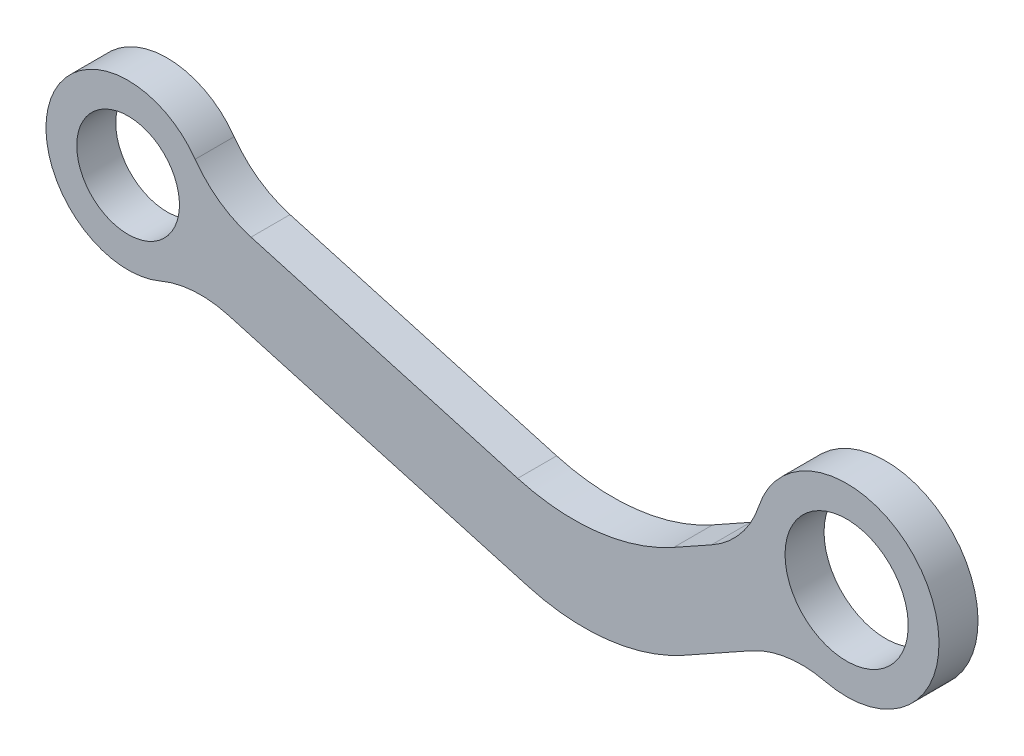
ISO-10303-21;
HEADER;
FILE_DESCRIPTION(('STEP AP214'),'2;1');
FILE_NAME('part.step','',(''),(''),'','','');
FILE_SCHEMA(('AUTOMOTIVE_DESIGN { 1 0 10303 214 1 1 1 1 }'));
ENDSEC;
DATA;
#1=APPLICATION_CONTEXT('core data for automotive mechanical design processes');
#2=APPLICATION_PROTOCOL_DEFINITION('international standard','automotive_design',2000,#1);
#3=PRODUCT_CONTEXT('',#1,'mechanical');
#4=PRODUCT('Part','Part','',(#3));
#5=PRODUCT_RELATED_PRODUCT_CATEGORY('part','',(#4));
#6=PRODUCT_DEFINITION_FORMATION('','',#4);
#7=PRODUCT_DEFINITION_CONTEXT('part definition',#1,'design');
#8=PRODUCT_DEFINITION('design','',#6,#7);
#9=PRODUCT_DEFINITION_SHAPE('','',#8);
#10=(LENGTH_UNIT() NAMED_UNIT(*) SI_UNIT(.MILLI.,.METRE.));
#11=(NAMED_UNIT(*) PLANE_ANGLE_UNIT() SI_UNIT($,.RADIAN.));
#12=(NAMED_UNIT(*) SI_UNIT($,.STERADIAN.) SOLID_ANGLE_UNIT());
#13=UNCERTAINTY_MEASURE_WITH_UNIT(LENGTH_MEASURE(1.E-05),#10,'distance_accuracy_value','');
#14=(GEOMETRIC_REPRESENTATION_CONTEXT(3) GLOBAL_UNCERTAINTY_ASSIGNED_CONTEXT((#13)) GLOBAL_UNIT_ASSIGNED_CONTEXT((#10,
#11,#12)) REPRESENTATION_CONTEXT('',''));
#15=CARTESIAN_POINT('',(0.,0.,0.));
#16=DIRECTION('',(0.,0.,1.));
#17=DIRECTION('',(1.,0.,0.));
#18=AXIS2_PLACEMENT_3D('',#15,#16,#17);
#19=CARTESIAN_POINT('',(35.,0.,1.9));
#20=DIRECTION('',(0.,0.,1.));
#21=DIRECTION('',(1.,0.,0.));
#22=AXIS2_PLACEMENT_3D('',#19,#20,#21);
#23=PLANE('',#22);
#24=CARTESIAN_POINT('',(0.,0.,1.9));
#25=DIRECTION('',(0.,0.,1.));
#26=DIRECTION('',(1.,0.,0.));
#27=AXIS2_PLACEMENT_3D('',#24,#25,#26);
#28=CIRCLE('',#27,4.);
#29=CARTESIAN_POINT('',(3.26736744020698,2.30744664308306,1.9));
#30=VERTEX_POINT('',#29);
#31=CARTESIAN_POINT('',(1.57031116535926,-3.67887521451164,1.9));
#32=VERTEX_POINT('',#31);
#33=EDGE_CURVE('E219',#30,#32,#28,.T.);
#34=ORIENTED_EDGE('',*,*,#33,.T.);
#35=CARTESIAN_POINT('',(3.53320012205833,-8.27746923265118,1.9));
#36=DIRECTION('',(0.,0.,1.));
#37=DIRECTION('',(1.,0.,0.));
#38=AXIS2_PLACEMENT_3D('',#35,#36,#37);
#39=CIRCLE('',#38,5.);
#40=CARTESIAN_POINT('',(4.89690605720382,-3.46703202565544,1.9));
#41=VERTEX_POINT('',#40);
#42=EDGE_CURVE('E48',#32,#41,#39,.F.);
#43=ORIENTED_EDGE('',*,*,#42,.T.);
#44=DIRECTION('',(0.962087441399148,-0.272741187029097,0.));
#45=VECTOR('',#44,1.);
#46=CARTESIAN_POINT('',(23.4639350524484,-8.73058012935193,1.9));
#47=LINE('',#46,#45);
#48=CARTESIAN_POINT('',(19.4788383882849,-7.60084914250003,1.9));
#49=VERTEX_POINT('',#48);
#50=EDGE_CURVE('E225',#41,#49,#47,.T.);
#51=ORIENTED_EDGE('',*,*,#50,.T.);
#52=CARTESIAN_POINT('',(22.2062502585758,2.02002527149145,1.9));
#53=DIRECTION('',(0.,0.,1.));
#54=DIRECTION('',(1.,0.,0.));
#55=AXIS2_PLACEMENT_3D('',#52,#53,#54);
#56=CIRCLE('',#55,10.);
#57=CARTESIAN_POINT('',(27.0806643690819,-6.7115316961575,1.9));
#58=VERTEX_POINT('',#57);
#59=EDGE_CURVE('E167',#49,#58,#56,.T.);
#60=ORIENTED_EDGE('',*,*,#59,.T.);
#61=DIRECTION('',(0.873155696764895,0.487441411050611,0.));
#62=VECTOR('',#61,1.);
#63=CARTESIAN_POINT('',(32.4550796812443,-3.71125054007198,1.9));
#64=LINE('',#63,#62);
#65=CARTESIAN_POINT('',(30.3669388209355,-4.8769605402387,1.9));
#66=VERTEX_POINT('',#65);
#67=EDGE_CURVE('E238',#58,#66,#64,.T.);
#68=ORIENTED_EDGE('',*,*,#67,.T.);
#69=CARTESIAN_POINT('',(32.8041458761885,-9.24273902406317,1.9));
#70=DIRECTION('',(0.,0.,1.));
#71=DIRECTION('',(1.,0.,0.));
#72=AXIS2_PLACEMENT_3D('',#69,#70,#71);
#73=CIRCLE('',#72,5.);
#74=CARTESIAN_POINT('',(33.9598585729314,-4.37813953771414,1.9));
#75=VERTEX_POINT('',#74);
#76=EDGE_CURVE('E192',#66,#75,#73,.F.);
#77=ORIENTED_EDGE('',*,*,#76,.T.);
#78=CARTESIAN_POINT('',(35.,0.,1.9));
#79=DIRECTION('',(0.,0.,1.));
#80=DIRECTION('',(1.,0.,0.));
#81=AXIS2_PLACEMENT_3D('',#78,#79,#80);
#82=CIRCLE('',#81,4.5);
#83=CARTESIAN_POINT('',(30.7273523733326,1.41226139872675,1.9));
#84=VERTEX_POINT('',#83);
#85=EDGE_CURVE('E156',#75,#84,#82,.T.);
#86=ORIENTED_EDGE('',*,*,#85,.T.);
#87=CARTESIAN_POINT('',(25.97996612148,2.98144073064536,1.9));
#88=DIRECTION('',(0.,0.,1.));
#89=DIRECTION('',(1.,0.,0.));
#90=AXIS2_PLACEMENT_3D('',#87,#88,#89);
#91=CIRCLE('',#90,5.);
#92=CARTESIAN_POINT('',(28.417173176733,-1.38433775317912,1.9));
#93=VERTEX_POINT('',#92);
#94=EDGE_CURVE('E196',#84,#93,#91,.F.);
#95=ORIENTED_EDGE('',*,*,#94,.T.);
#96=DIRECTION('',(-0.873155696764895,-0.487441411050611,0.));
#97=VECTOR('',#96,1.);
#98=CARTESIAN_POINT('',(30.5053140370419,-0.218627753012396,1.9));
#99=LINE('',#98,#97);
#100=CARTESIAN_POINT('',(26.5775904515329,-2.41128953582015,1.9));
#101=VERTEX_POINT('',#100);
#102=EDGE_CURVE('E235',#93,#101,#99,.T.);
#103=ORIENTED_EDGE('',*,*,#102,.T.);
#104=CARTESIAN_POINT('',(21.7031763410268,6.3202674318288,1.9));
#105=DIRECTION('',(0.,0.,1.));
#106=DIRECTION('',(1.,0.,0.));
#107=AXIS2_PLACEMENT_3D('',#104,#105,#106);
#108=CIRCLE('',#107,10.);
#109=CARTESIAN_POINT('',(18.9757644707358,-3.30060698216268,1.9));
#110=VERTEX_POINT('',#109);
#111=EDGE_CURVE('E142',#101,#110,#108,.F.);
#112=ORIENTED_EDGE('',*,*,#111,.T.);
#113=DIRECTION('',(-0.962087441399148,0.272741187029097,0.));
#114=VECTOR('',#113,1.);
#115=CARTESIAN_POINT('',(22.9608611348994,-4.43033796901458,1.9));
#116=LINE('',#115,#114);
#117=CARTESIAN_POINT('',(5.98787080532022,0.381317739941151,1.9));
#118=VERTEX_POINT('',#117);
#119=EDGE_CURVE('E220',#110,#118,#116,.T.);
#120=ORIENTED_EDGE('',*,*,#119,.T.);
#121=CARTESIAN_POINT('',(7.3515767404657,5.19175494693689,1.9));
#122=DIRECTION('',(0.,0.,1.));
#123=DIRECTION('',(1.,0.,0.));
#124=AXIS2_PLACEMENT_3D('',#121,#122,#123);
#125=CIRCLE('',#124,5.);
#126=EDGE_CURVE('E200',#118,#30,#125,.F.);
#127=ORIENTED_EDGE('',*,*,#126,.T.);
#128=EDGE_LOOP('',(#34,#43,#51,#60,#68,#77,#86,#95,#103,#112,#120,#127));
#129=FACE_BOUND('',#128,.T.);
#130=CARTESIAN_POINT('',(35.,0.,1.9));
#131=DIRECTION('',(0.,0.,1.));
#132=DIRECTION('',(1.,0.,0.));
#133=AXIS2_PLACEMENT_3D('',#130,#131,#132);
#134=CIRCLE('',#133,3.);
#135=CARTESIAN_POINT('',(32.,0.,1.9));
#136=VERTEX_POINT('',#135);
#137=EDGE_CURVE('E242',#136,#136,#134,.T.);
#138=ORIENTED_EDGE('',*,*,#137,.F.);
#139=EDGE_LOOP('',(#138));
#140=FACE_BOUND('',#139,.T.);
#141=CARTESIAN_POINT('',(0.,0.,1.9));
#142=DIRECTION('',(0.,0.,1.));
#143=DIRECTION('',(1.,0.,0.));
#144=AXIS2_PLACEMENT_3D('',#141,#142,#143);
#145=CIRCLE('',#144,2.5);
#146=CARTESIAN_POINT('',(-2.5,0.,1.9));
#147=VERTEX_POINT('',#146);
#148=EDGE_CURVE('E227',#147,#147,#145,.T.);
#149=ORIENTED_EDGE('',*,*,#148,.F.);
#150=EDGE_LOOP('',(#149));
#151=FACE_BOUND('',#150,.T.);
#152=ADVANCED_FACE('F40',(#129,#140,#151),#23,.T.);
#153=CARTESIAN_POINT('',(35.,0.,0.));
#154=DIRECTION('',(0.,0.,1.));
#155=DIRECTION('',(1.,0.,0.));
#156=AXIS2_PLACEMENT_3D('',#153,#154,#155);
#157=PLANE('',#156);
#158=CARTESIAN_POINT('',(35.,0.,0.));
#159=DIRECTION('',(0.,0.,1.));
#160=DIRECTION('',(1.,0.,0.));
#161=AXIS2_PLACEMENT_3D('',#158,#159,#160);
#162=CIRCLE('',#161,4.5);
#163=CARTESIAN_POINT('',(33.9598585729314,-4.37813953771414,0.));
#164=VERTEX_POINT('',#163);
#165=CARTESIAN_POINT('',(30.7273523733326,1.41226139872675,0.));
#166=VERTEX_POINT('',#165);
#167=EDGE_CURVE('E161',#164,#166,#162,.T.);
#168=ORIENTED_EDGE('',*,*,#167,.F.);
#169=CARTESIAN_POINT('',(32.8041458761885,-9.24273902406317,0.));
#170=DIRECTION('',(0.,0.,1.));
#171=DIRECTION('',(1.,0.,0.));
#172=AXIS2_PLACEMENT_3D('',#169,#170,#171);
#173=CIRCLE('',#172,5.);
#174=CARTESIAN_POINT('',(30.3669388209355,-4.8769605402387,0.));
#175=VERTEX_POINT('',#174);
#176=EDGE_CURVE('E194',#164,#175,#173,.T.);
#177=ORIENTED_EDGE('',*,*,#176,.T.);
#178=DIRECTION('',(-0.873155696764895,-0.487441411050611,0.));
#179=VECTOR('',#178,1.);
#180=CARTESIAN_POINT('',(32.4550796812443,-3.71125054007198,0.));
#181=LINE('',#180,#179);
#182=CARTESIAN_POINT('',(27.0806643690819,-6.7115316961575,0.));
#183=VERTEX_POINT('',#182);
#184=EDGE_CURVE('E151',#175,#183,#181,.T.);
#185=ORIENTED_EDGE('',*,*,#184,.T.);
#186=CARTESIAN_POINT('',(22.2062502585758,2.02002527149145,0.));
#187=DIRECTION('',(0.,0.,1.));
#188=DIRECTION('',(1.,0.,0.));
#189=AXIS2_PLACEMENT_3D('',#186,#187,#188);
#190=CIRCLE('',#189,10.);
#191=CARTESIAN_POINT('',(19.4788383882849,-7.60084914250003,0.));
#192=VERTEX_POINT('',#191);
#193=EDGE_CURVE('E172',#183,#192,#190,.F.);
#194=ORIENTED_EDGE('',*,*,#193,.T.);
#195=DIRECTION('',(-0.962087441399148,0.272741187029097,0.));
#196=VECTOR('',#195,1.);
#197=CARTESIAN_POINT('',(23.4639350524484,-8.73058012935193,0.));
#198=LINE('',#197,#196);
#199=CARTESIAN_POINT('',(4.89690605720381,-3.46703202565544,0.));
#200=VERTEX_POINT('',#199);
#201=EDGE_CURVE('E233',#192,#200,#198,.T.);
#202=ORIENTED_EDGE('',*,*,#201,.T.);
#203=CARTESIAN_POINT('',(3.53320012205833,-8.27746923265118,0.));
#204=DIRECTION('',(0.,0.,1.));
#205=DIRECTION('',(1.,0.,0.));
#206=AXIS2_PLACEMENT_3D('',#203,#204,#205);
#207=CIRCLE('',#206,5.);
#208=CARTESIAN_POINT('',(1.57031116535926,-3.67887521451164,0.));
#209=VERTEX_POINT('',#208);
#210=EDGE_CURVE('E11',#200,#209,#207,.T.);
#211=ORIENTED_EDGE('',*,*,#210,.T.);
#212=CARTESIAN_POINT('',(0.,0.,0.));
#213=DIRECTION('',(0.,0.,1.));
#214=DIRECTION('',(1.,0.,0.));
#215=AXIS2_PLACEMENT_3D('',#212,#213,#214);
#216=CIRCLE('',#215,4.);
#217=CARTESIAN_POINT('',(3.26736744020698,2.30744664308306,0.));
#218=VERTEX_POINT('',#217);
#219=EDGE_CURVE('E206',#218,#209,#216,.T.);
#220=ORIENTED_EDGE('',*,*,#219,.F.);
#221=CARTESIAN_POINT('',(7.3515767404657,5.19175494693689,0.));
#222=DIRECTION('',(0.,0.,1.));
#223=DIRECTION('',(1.,0.,0.));
#224=AXIS2_PLACEMENT_3D('',#221,#222,#223);
#225=CIRCLE('',#224,5.);
#226=CARTESIAN_POINT('',(5.98787080532022,0.381317739941151,0.));
#227=VERTEX_POINT('',#226);
#228=EDGE_CURVE('E202',#218,#227,#225,.T.);
#229=ORIENTED_EDGE('',*,*,#228,.T.);
#230=DIRECTION('',(0.962087441399148,-0.272741187029097,0.));
#231=VECTOR('',#230,1.);
#232=CARTESIAN_POINT('',(22.9608611348994,-4.43033796901458,0.));
#233=LINE('',#232,#231);
#234=CARTESIAN_POINT('',(18.9757644707358,-3.30060698216268,0.));
#235=VERTEX_POINT('',#234);
#236=EDGE_CURVE('E136',#227,#235,#233,.T.);
#237=ORIENTED_EDGE('',*,*,#236,.T.);
#238=CARTESIAN_POINT('',(21.7031763410268,6.3202674318288,0.));
#239=DIRECTION('',(0.,0.,1.));
#240=DIRECTION('',(1.,0.,0.));
#241=AXIS2_PLACEMENT_3D('',#238,#239,#240);
#242=CIRCLE('',#241,10.);
#243=CARTESIAN_POINT('',(26.5775904515329,-2.41128953582015,0.));
#244=VERTEX_POINT('',#243);
#245=EDGE_CURVE('E128',#235,#244,#242,.T.);
#246=ORIENTED_EDGE('',*,*,#245,.T.);
#247=DIRECTION('',(0.873155696764895,0.487441411050611,0.));
#248=VECTOR('',#247,1.);
#249=CARTESIAN_POINT('',(30.5053140370419,-0.218627753012396,0.));
#250=LINE('',#249,#248);
#251=CARTESIAN_POINT('',(28.417173176733,-1.38433775317912,0.));
#252=VERTEX_POINT('',#251);
#253=EDGE_CURVE('E133',#244,#252,#250,.T.);
#254=ORIENTED_EDGE('',*,*,#253,.T.);
#255=CARTESIAN_POINT('',(25.97996612148,2.98144073064536,0.));
#256=DIRECTION('',(0.,0.,1.));
#257=DIRECTION('',(1.,0.,0.));
#258=AXIS2_PLACEMENT_3D('',#255,#256,#257);
#259=CIRCLE('',#258,5.);
#260=EDGE_CURVE('E198',#252,#166,#259,.T.);
#261=ORIENTED_EDGE('',*,*,#260,.T.);
#262=EDGE_LOOP('',(#168,#177,#185,#194,#202,#211,#220,#229,#237,#246,#254,#261));
#263=FACE_BOUND('',#262,.T.);
#264=CARTESIAN_POINT('',(35.,0.,0.));
#265=DIRECTION('',(0.,0.,1.));
#266=DIRECTION('',(1.,0.,0.));
#267=AXIS2_PLACEMENT_3D('',#264,#265,#266);
#268=CIRCLE('',#267,3.);
#269=CARTESIAN_POINT('',(32.,0.,0.));
#270=VERTEX_POINT('',#269);
#271=EDGE_CURVE('E214',#270,#270,#268,.T.);
#272=ORIENTED_EDGE('',*,*,#271,.T.);
#273=EDGE_LOOP('',(#272));
#274=FACE_BOUND('',#273,.T.);
#275=CARTESIAN_POINT('',(0.,0.,0.));
#276=DIRECTION('',(0.,0.,1.));
#277=DIRECTION('',(1.,0.,0.));
#278=AXIS2_PLACEMENT_3D('',#275,#276,#277);
#279=CIRCLE('',#278,2.5);
#280=CARTESIAN_POINT('',(-2.5,0.,0.));
#281=VERTEX_POINT('',#280);
#282=EDGE_CURVE('E230',#281,#281,#279,.T.);
#283=ORIENTED_EDGE('',*,*,#282,.T.);
#284=EDGE_LOOP('',(#283));
#285=FACE_BOUND('',#284,.T.);
#286=ADVANCED_FACE('F131',(#263,#274,#285),#157,.F.);
#287=CARTESIAN_POINT('',(35.,0.,1.9));
#288=DIRECTION('',(0.,0.,-1.));
#289=DIRECTION('',(-1.,0.,0.));
#290=AXIS2_PLACEMENT_3D('',#287,#288,#289);
#291=CYLINDRICAL_SURFACE('',#290,4.5);
#292=ORIENTED_EDGE('',*,*,#85,.F.);
#293=DIRECTION('',(0.,0.,-1.));
#294=VECTOR('',#293,1.);
#295=CARTESIAN_POINT('',(33.9598585729314,-4.37813953771414,1.9));
#296=LINE('',#295,#294);
#297=EDGE_CURVE('E180',#75,#164,#296,.T.);
#298=ORIENTED_EDGE('',*,*,#297,.T.);
#299=ORIENTED_EDGE('',*,*,#167,.T.);
#300=DIRECTION('',(0.,0.,-1.));
#301=VECTOR('',#300,1.);
#302=CARTESIAN_POINT('',(30.7273523733326,1.41226139872675,1.9));
#303=LINE('',#302,#301);
#304=EDGE_CURVE('E177',#166,#84,#303,.F.);
#305=ORIENTED_EDGE('',*,*,#304,.T.);
#306=EDGE_LOOP('',(#292,#298,#299,#305));
#307=FACE_BOUND('',#306,.T.);
#308=ADVANCED_FACE('F251',(#307),#291,.T.);
#309=CARTESIAN_POINT('',(35.,0.,1.9));
#310=DIRECTION('',(0.,0.,-1.));
#311=DIRECTION('',(-1.,0.,0.));
#312=AXIS2_PLACEMENT_3D('',#309,#310,#311);
#313=CYLINDRICAL_SURFACE('',#312,3.);
#314=CARTESIAN_POINT('',(32.,0.,1.9));
#315=CARTESIAN_POINT('',(32.,0.,1.88020833333333));
#316=CARTESIAN_POINT('',(32.,0.,1.86041666666667));
#317=CARTESIAN_POINT('',(32.,0.,1.82083333333333));
#318=CARTESIAN_POINT('',(32.,0.,1.80104166666667));
#319=CARTESIAN_POINT('',(32.,0.,1.76145833333333));
#320=CARTESIAN_POINT('',(32.,0.,1.74166666666667));
#321=CARTESIAN_POINT('',(32.,0.,1.70208333333333));
#322=CARTESIAN_POINT('',(32.,0.,1.68229166666667));
#323=CARTESIAN_POINT('',(32.,0.,1.64270833333333));
#324=CARTESIAN_POINT('',(32.,0.,1.62291666666667));
#325=CARTESIAN_POINT('',(32.,0.,1.58333333333333));
#326=CARTESIAN_POINT('',(32.,0.,1.56354166666667));
#327=CARTESIAN_POINT('',(32.,0.,1.52395833333333));
#328=CARTESIAN_POINT('',(32.,0.,1.50416666666667));
#329=CARTESIAN_POINT('',(32.,0.,1.46458333333333));
#330=CARTESIAN_POINT('',(32.,0.,1.44479166666667));
#331=CARTESIAN_POINT('',(32.,0.,1.40520833333333));
#332=CARTESIAN_POINT('',(32.,0.,1.38541666666667));
#333=CARTESIAN_POINT('',(32.,0.,1.34583333333333));
#334=CARTESIAN_POINT('',(32.,0.,1.32604166666667));
#335=CARTESIAN_POINT('',(32.,0.,1.28645833333333));
#336=CARTESIAN_POINT('',(32.,0.,1.26666666666667));
#337=CARTESIAN_POINT('',(32.,0.,1.22708333333333));
#338=CARTESIAN_POINT('',(32.,0.,1.20729166666667));
#339=CARTESIAN_POINT('',(32.,0.,1.16770833333333));
#340=CARTESIAN_POINT('',(32.,0.,1.14791666666667));
#341=CARTESIAN_POINT('',(32.,0.,1.10833333333333));
#342=CARTESIAN_POINT('',(32.,0.,1.08854166666667));
#343=CARTESIAN_POINT('',(32.,0.,1.04895833333333));
#344=CARTESIAN_POINT('',(32.,0.,1.02916666666667));
#345=CARTESIAN_POINT('',(32.,0.,0.989583333333333));
#346=CARTESIAN_POINT('',(32.,0.,0.969791666666667));
#347=CARTESIAN_POINT('',(32.,0.,0.930208333333333));
#348=CARTESIAN_POINT('',(32.,0.,0.910416666666667));
#349=CARTESIAN_POINT('',(32.,0.,0.870833333333333));
#350=CARTESIAN_POINT('',(32.,0.,0.851041666666667));
#351=CARTESIAN_POINT('',(32.,0.,0.811458333333333));
#352=CARTESIAN_POINT('',(32.,0.,0.791666666666667));
#353=CARTESIAN_POINT('',(32.,0.,0.752083333333333));
#354=CARTESIAN_POINT('',(32.,0.,0.732291666666667));
#355=CARTESIAN_POINT('',(32.,0.,0.692708333333333));
#356=CARTESIAN_POINT('',(32.,0.,0.672916666666667));
#357=CARTESIAN_POINT('',(32.,0.,0.633333333333333));
#358=CARTESIAN_POINT('',(32.,0.,0.613541666666667));
#359=CARTESIAN_POINT('',(32.,0.,0.573958333333333));
#360=CARTESIAN_POINT('',(32.,0.,0.554166666666667));
#361=CARTESIAN_POINT('',(32.,0.,0.514583333333333));
#362=CARTESIAN_POINT('',(32.,0.,0.494791666666667));
#363=CARTESIAN_POINT('',(32.,0.,0.455208333333333));
#364=CARTESIAN_POINT('',(32.,0.,0.435416666666667));
#365=CARTESIAN_POINT('',(32.,0.,0.395833333333333));
#366=CARTESIAN_POINT('',(32.,0.,0.376041666666667));
#367=CARTESIAN_POINT('',(32.,0.,0.336458333333333));
#368=CARTESIAN_POINT('',(32.,0.,0.316666666666667));
#369=CARTESIAN_POINT('',(32.,0.,0.277083333333333));
#370=CARTESIAN_POINT('',(32.,0.,0.257291666666667));
#371=CARTESIAN_POINT('',(32.,0.,0.217708333333333));
#372=CARTESIAN_POINT('',(32.,0.,0.197916666666667));
#373=CARTESIAN_POINT('',(32.,0.,0.158333333333333));
#374=CARTESIAN_POINT('',(32.,0.,0.138541666666667));
#375=CARTESIAN_POINT('',(32.,0.,0.0989583333333333));
#376=CARTESIAN_POINT('',(32.,0.,0.0791666666666666));
#377=CARTESIAN_POINT('',(32.,0.,0.0395833333333333));
#378=CARTESIAN_POINT('',(32.,0.,0.0197916666666666));
#379=CARTESIAN_POINT('',(32.,0.,0.));
#380=B_SPLINE_CURVE_WITH_KNOTS('',3,(#314,#315,#316,#317,#318,#319,#320,#321,#322,#323,#324,
#325,#326,#327,#328,#329,#330,#331,#332,#333,#334,#335,#336,#337,#338,#339,#340,#341,#342,#343,
#344,#345,#346,#347,#348,#349,#350,#351,#352,#353,#354,#355,#356,#357,#358,#359,#360,#361,#362,
#363,#364,#365,#366,#367,#368,#369,#370,#371,#372,#373,#374,#375,#376,#377,#378,#379),
.UNSPECIFIED.,.F.,.F.,(4,2,2,2,2,2,2,2,2,2,2,2,2,2,2,2,2,2,2,2,2,2,2,2,2,2,2,2,2,2,2,2,4),(0.,
0.059375,0.11875,0.178125,0.2375,0.296875,0.35625,0.415625,0.475,0.534375,0.59375,0.653125,
0.7125,0.771875,0.83125,0.890625,0.95,1.009375,1.06875,1.128125,1.1875,1.246875,1.30625,
1.365625,1.425,1.484375,1.54375,1.603125,1.6625,1.721875,1.78125,1.840625,1.9),.UNSPECIFIED.);
#381=EDGE_CURVE('BSEAM249',#136,#270,#380,.T.);
#382=ORIENTED_EDGE('',*,*,#137,.T.);
#383=ORIENTED_EDGE('',*,*,#271,.F.);
#384=ORIENTED_EDGE('',*,*,#381,.T.);
#385=ORIENTED_EDGE('',*,*,#381,.F.);
#386=EDGE_LOOP('',(#382,#384,#383,#385));
#387=FACE_BOUND('',#386,.T.);
#388=ADVANCED_FACE('F249',(#387),#313,.F.);
#389=CARTESIAN_POINT('',(22.9608611348994,-4.43033796901458,-31.2163599643402));
#390=DIRECTION('',(0.272741187029097,0.962087441399148,0.));
#391=DIRECTION('',(-0.962087441399148,0.272741187029097,0.));
#392=AXIS2_PLACEMENT_3D('',#389,#390,#391);
#393=PLANE('',#392);
#394=ORIENTED_EDGE('',*,*,#236,.F.);
#395=DIRECTION('',(0.,0.,-1.));
#396=VECTOR('',#395,1.);
#397=CARTESIAN_POINT('',(5.98787080532022,0.38131773994115,-31.2163599643402));
#398=LINE('',#397,#396);
#399=EDGE_CURVE('E183',#227,#118,#398,.F.);
#400=ORIENTED_EDGE('',*,*,#399,.T.);
#401=ORIENTED_EDGE('',*,*,#119,.F.);
#402=DIRECTION('',(0.,0.,1.));
#403=VECTOR('',#402,1.);
#404=CARTESIAN_POINT('',(18.9757644707358,-3.30060698216268,0.));
#405=LINE('',#404,#403);
#406=EDGE_CURVE('E155',#110,#235,#405,.F.);
#407=ORIENTED_EDGE('',*,*,#406,.T.);
#408=EDGE_LOOP('',(#394,#400,#401,#407));
#409=FACE_BOUND('',#408,.T.);
#410=ADVANCED_FACE('F211',(#409),#393,.T.);
#411=CARTESIAN_POINT('',(30.5053140370419,-0.218627753012396,-31.2163599643402));
#412=DIRECTION('',(-0.487441411050611,0.873155696764895,0.));
#413=DIRECTION('',(-0.873155696764895,-0.487441411050611,0.));
#414=AXIS2_PLACEMENT_3D('',#411,#412,#413);
#415=PLANE('',#414);
#416=ORIENTED_EDGE('',*,*,#102,.F.);
#417=DIRECTION('',(0.,0.,-1.));
#418=VECTOR('',#417,1.);
#419=CARTESIAN_POINT('',(28.417173176733,-1.38433775317912,-31.2163599643402));
#420=LINE('',#419,#418);
#421=EDGE_CURVE('E150',#93,#252,#420,.T.);
#422=ORIENTED_EDGE('',*,*,#421,.T.);
#423=ORIENTED_EDGE('',*,*,#253,.F.);
#424=DIRECTION('',(0.,0.,1.));
#425=VECTOR('',#424,1.);
#426=CARTESIAN_POINT('',(26.5775904515329,-2.41128953582015,1.9));
#427=LINE('',#426,#425);
#428=EDGE_CURVE('E148',#244,#101,#427,.T.);
#429=ORIENTED_EDGE('',*,*,#428,.T.);
#430=EDGE_LOOP('',(#416,#422,#423,#429));
#431=FACE_BOUND('',#430,.T.);
#432=ADVANCED_FACE('F147',(#431),#415,.T.);
#433=CARTESIAN_POINT('',(32.4550796812443,-3.71125054007198,-31.2163599643402));
#434=DIRECTION('',(0.487441411050611,-0.873155696764895,0.));
#435=DIRECTION('',(0.873155696764895,0.487441411050611,0.));
#436=AXIS2_PLACEMENT_3D('',#433,#434,#435);
#437=PLANE('',#436);
#438=ORIENTED_EDGE('',*,*,#184,.F.);
#439=DIRECTION('',(0.,0.,-1.));
#440=VECTOR('',#439,1.);
#441=CARTESIAN_POINT('',(30.3669388209355,-4.8769605402387,-31.2163599643402));
#442=LINE('',#441,#440);
#443=EDGE_CURVE('E141',#175,#66,#442,.F.);
#444=ORIENTED_EDGE('',*,*,#443,.T.);
#445=ORIENTED_EDGE('',*,*,#67,.F.);
#446=DIRECTION('',(0.,0.,1.));
#447=VECTOR('',#446,1.);
#448=CARTESIAN_POINT('',(27.0806643690819,-6.7115316961575,-31.2163599643402));
#449=LINE('',#448,#447);
#450=EDGE_CURVE('E169',#58,#183,#449,.F.);
#451=ORIENTED_EDGE('',*,*,#450,.T.);
#452=EDGE_LOOP('',(#438,#444,#445,#451));
#453=FACE_BOUND('',#452,.T.);
#454=ADVANCED_FACE('F298',(#453),#437,.T.);
#455=CARTESIAN_POINT('',(23.4639350524484,-8.73058012935193,-31.2163599643402));
#456=DIRECTION('',(-0.272741187029097,-0.962087441399148,0.));
#457=DIRECTION('',(0.962087441399148,-0.272741187029097,0.));
#458=AXIS2_PLACEMENT_3D('',#455,#456,#457);
#459=PLANE('',#458);
#460=ORIENTED_EDGE('',*,*,#50,.F.);
#461=DIRECTION('',(0.,0.,-1.));
#462=VECTOR('',#461,1.);
#463=CARTESIAN_POINT('',(4.89690605720382,-3.46703202565544,-31.2163599643402));
#464=LINE('',#463,#462);
#465=EDGE_CURVE('E61',#41,#200,#464,.T.);
#466=ORIENTED_EDGE('',*,*,#465,.T.);
#467=ORIENTED_EDGE('',*,*,#201,.F.);
#468=DIRECTION('',(0.,0.,1.));
#469=VECTOR('',#468,1.);
#470=CARTESIAN_POINT('',(19.4788383882849,-7.60084914250003,-31.2163599643402));
#471=LINE('',#470,#469);
#472=EDGE_CURVE('E158',#192,#49,#471,.T.);
#473=ORIENTED_EDGE('',*,*,#472,.T.);
#474=EDGE_LOOP('',(#460,#466,#467,#473));
#475=FACE_BOUND('',#474,.T.);
#476=ADVANCED_FACE('F292',(#475),#459,.T.);
#477=CARTESIAN_POINT('',(0.,0.,1.9));
#478=DIRECTION('',(0.,0.,-1.));
#479=DIRECTION('',(-1.,0.,0.));
#480=AXIS2_PLACEMENT_3D('',#477,#478,#479);
#481=CYLINDRICAL_SURFACE('',#480,4.);
#482=ORIENTED_EDGE('',*,*,#33,.F.);
#483=DIRECTION('',(0.,0.,-1.));
#484=VECTOR('',#483,1.);
#485=CARTESIAN_POINT('',(3.26736744020698,2.30744664308306,1.9));
#486=LINE('',#485,#484);
#487=EDGE_CURVE('E189',#30,#218,#486,.T.);
#488=ORIENTED_EDGE('',*,*,#487,.T.);
#489=ORIENTED_EDGE('',*,*,#219,.T.);
#490=DIRECTION('',(0.,0.,-1.));
#491=VECTOR('',#490,1.);
#492=CARTESIAN_POINT('',(1.57031116535926,-3.67887521451164,1.9));
#493=LINE('',#492,#491);
#494=EDGE_CURVE('E186',#209,#32,#493,.F.);
#495=ORIENTED_EDGE('',*,*,#494,.T.);
#496=EDGE_LOOP('',(#482,#488,#489,#495));
#497=FACE_BOUND('',#496,.T.);
#498=ADVANCED_FACE('F222',(#497),#481,.T.);
#499=CARTESIAN_POINT('',(0.,0.,1.9));
#500=DIRECTION('',(0.,0.,-1.));
#501=DIRECTION('',(-1.,0.,0.));
#502=AXIS2_PLACEMENT_3D('',#499,#500,#501);
#503=CYLINDRICAL_SURFACE('',#502,2.5);
#504=CARTESIAN_POINT('',(-2.5,0.,1.9));
#505=CARTESIAN_POINT('',(-2.5,0.,1.88020833333333));
#506=CARTESIAN_POINT('',(-2.5,0.,1.86041666666667));
#507=CARTESIAN_POINT('',(-2.5,0.,1.82083333333333));
#508=CARTESIAN_POINT('',(-2.5,0.,1.80104166666667));
#509=CARTESIAN_POINT('',(-2.5,0.,1.76145833333333));
#510=CARTESIAN_POINT('',(-2.5,0.,1.74166666666667));
#511=CARTESIAN_POINT('',(-2.5,0.,1.70208333333333));
#512=CARTESIAN_POINT('',(-2.5,0.,1.68229166666667));
#513=CARTESIAN_POINT('',(-2.5,0.,1.64270833333333));
#514=CARTESIAN_POINT('',(-2.5,0.,1.62291666666667));
#515=CARTESIAN_POINT('',(-2.5,0.,1.58333333333333));
#516=CARTESIAN_POINT('',(-2.5,0.,1.56354166666667));
#517=CARTESIAN_POINT('',(-2.5,0.,1.52395833333333));
#518=CARTESIAN_POINT('',(-2.5,0.,1.50416666666667));
#519=CARTESIAN_POINT('',(-2.5,0.,1.46458333333333));
#520=CARTESIAN_POINT('',(-2.5,0.,1.44479166666667));
#521=CARTESIAN_POINT('',(-2.5,0.,1.40520833333333));
#522=CARTESIAN_POINT('',(-2.5,0.,1.38541666666667));
#523=CARTESIAN_POINT('',(-2.5,0.,1.34583333333333));
#524=CARTESIAN_POINT('',(-2.5,0.,1.32604166666667));
#525=CARTESIAN_POINT('',(-2.5,0.,1.28645833333333));
#526=CARTESIAN_POINT('',(-2.5,0.,1.26666666666667));
#527=CARTESIAN_POINT('',(-2.5,0.,1.22708333333333));
#528=CARTESIAN_POINT('',(-2.5,0.,1.20729166666667));
#529=CARTESIAN_POINT('',(-2.5,0.,1.16770833333333));
#530=CARTESIAN_POINT('',(-2.5,0.,1.14791666666667));
#531=CARTESIAN_POINT('',(-2.5,0.,1.10833333333333));
#532=CARTESIAN_POINT('',(-2.5,0.,1.08854166666667));
#533=CARTESIAN_POINT('',(-2.5,0.,1.04895833333333));
#534=CARTESIAN_POINT('',(-2.5,0.,1.02916666666667));
#535=CARTESIAN_POINT('',(-2.5,0.,0.989583333333333));
#536=CARTESIAN_POINT('',(-2.5,0.,0.969791666666667));
#537=CARTESIAN_POINT('',(-2.5,0.,0.930208333333333));
#538=CARTESIAN_POINT('',(-2.5,0.,0.910416666666667));
#539=CARTESIAN_POINT('',(-2.5,0.,0.870833333333333));
#540=CARTESIAN_POINT('',(-2.5,0.,0.851041666666667));
#541=CARTESIAN_POINT('',(-2.5,0.,0.811458333333333));
#542=CARTESIAN_POINT('',(-2.5,0.,0.791666666666667));
#543=CARTESIAN_POINT('',(-2.5,0.,0.752083333333333));
#544=CARTESIAN_POINT('',(-2.5,0.,0.732291666666667));
#545=CARTESIAN_POINT('',(-2.5,0.,0.692708333333333));
#546=CARTESIAN_POINT('',(-2.5,0.,0.672916666666667));
#547=CARTESIAN_POINT('',(-2.5,0.,0.633333333333333));
#548=CARTESIAN_POINT('',(-2.5,0.,0.613541666666667));
#549=CARTESIAN_POINT('',(-2.5,0.,0.573958333333333));
#550=CARTESIAN_POINT('',(-2.5,0.,0.554166666666667));
#551=CARTESIAN_POINT('',(-2.5,0.,0.514583333333333));
#552=CARTESIAN_POINT('',(-2.5,0.,0.494791666666667));
#553=CARTESIAN_POINT('',(-2.5,0.,0.455208333333333));
#554=CARTESIAN_POINT('',(-2.5,0.,0.435416666666667));
#555=CARTESIAN_POINT('',(-2.5,0.,0.395833333333333));
#556=CARTESIAN_POINT('',(-2.5,0.,0.376041666666667));
#557=CARTESIAN_POINT('',(-2.5,0.,0.336458333333333));
#558=CARTESIAN_POINT('',(-2.5,0.,0.316666666666667));
#559=CARTESIAN_POINT('',(-2.5,0.,0.277083333333333));
#560=CARTESIAN_POINT('',(-2.5,0.,0.257291666666667));
#561=CARTESIAN_POINT('',(-2.5,0.,0.217708333333333));
#562=CARTESIAN_POINT('',(-2.5,0.,0.197916666666667));
#563=CARTESIAN_POINT('',(-2.5,0.,0.158333333333333));
#564=CARTESIAN_POINT('',(-2.5,0.,0.138541666666667));
#565=CARTESIAN_POINT('',(-2.5,0.,0.0989583333333333));
#566=CARTESIAN_POINT('',(-2.5,0.,0.0791666666666666));
#567=CARTESIAN_POINT('',(-2.5,0.,0.0395833333333333));
#568=CARTESIAN_POINT('',(-2.5,0.,0.0197916666666666));
#569=CARTESIAN_POINT('',(-2.5,0.,0.));
#570=B_SPLINE_CURVE_WITH_KNOTS('',3,(#504,#505,#506,#507,#508,#509,#510,#511,#512,#513,#514,
#515,#516,#517,#518,#519,#520,#521,#522,#523,#524,#525,#526,#527,#528,#529,#530,#531,#532,#533,
#534,#535,#536,#537,#538,#539,#540,#541,#542,#543,#544,#545,#546,#547,#548,#549,#550,#551,#552,
#553,#554,#555,#556,#557,#558,#559,#560,#561,#562,#563,#564,#565,#566,#567,#568,#569),
.UNSPECIFIED.,.F.,.F.,(4,2,2,2,2,2,2,2,2,2,2,2,2,2,2,2,2,2,2,2,2,2,2,2,2,2,2,2,2,2,2,2,4),(0.,
0.059375,0.11875,0.178125,0.2375,0.296875,0.35625,0.415625,0.475,0.534375,0.59375,0.653125,
0.7125,0.771875,0.83125,0.890625,0.95,1.009375,1.06875,1.128125,1.1875,1.246875,1.30625,
1.365625,1.425,1.484375,1.54375,1.603125,1.6625,1.721875,1.78125,1.840625,1.9),.UNSPECIFIED.);
#571=EDGE_CURVE('BSEAM271',#147,#281,#570,.T.);
#572=ORIENTED_EDGE('',*,*,#148,.T.);
#573=ORIENTED_EDGE('',*,*,#282,.F.);
#574=ORIENTED_EDGE('',*,*,#571,.T.);
#575=ORIENTED_EDGE('',*,*,#571,.F.);
#576=EDGE_LOOP('',(#572,#574,#573,#575));
#577=FACE_BOUND('',#576,.T.);
#578=ADVANCED_FACE('F271',(#577),#503,.F.);
#579=CARTESIAN_POINT('',(21.7031763410268,6.3202674318288,-31.2163599643402));
#580=DIRECTION('',(0.,0.,-1.));
#581=DIRECTION('',(-1.,0.,0.));
#582=AXIS2_PLACEMENT_3D('',#579,#580,#581);
#583=CYLINDRICAL_SURFACE('',#582,10.);
#584=ORIENTED_EDGE('',*,*,#245,.F.);
#585=ORIENTED_EDGE('',*,*,#406,.F.);
#586=ORIENTED_EDGE('',*,*,#111,.F.);
#587=ORIENTED_EDGE('',*,*,#428,.F.);
#588=EDGE_LOOP('',(#584,#585,#586,#587));
#589=FACE_BOUND('',#588,.T.);
#590=ADVANCED_FACE('F154',(#589),#583,.F.);
#591=CARTESIAN_POINT('',(22.2062502585758,2.02002527149145,-31.2163599643402));
#592=DIRECTION('',(0.,0.,1.));
#593=DIRECTION('',(1.,0.,0.));
#594=AXIS2_PLACEMENT_3D('',#591,#592,#593);
#595=CYLINDRICAL_SURFACE('',#594,10.);
#596=ORIENTED_EDGE('',*,*,#193,.F.);
#597=ORIENTED_EDGE('',*,*,#450,.F.);
#598=ORIENTED_EDGE('',*,*,#59,.F.);
#599=ORIENTED_EDGE('',*,*,#472,.F.);
#600=EDGE_LOOP('',(#596,#597,#598,#599));
#601=FACE_BOUND('',#600,.T.);
#602=ADVANCED_FACE('F270',(#601),#595,.T.);
#603=CARTESIAN_POINT('',(32.8041458761885,-9.24273902406317,1.9));
#604=DIRECTION('',(0.,0.,-1.));
#605=DIRECTION('',(-1.,0.,0.));
#606=AXIS2_PLACEMENT_3D('',#603,#604,#605);
#607=CYLINDRICAL_SURFACE('',#606,5.);
#608=ORIENTED_EDGE('',*,*,#176,.F.);
#609=ORIENTED_EDGE('',*,*,#297,.F.);
#610=ORIENTED_EDGE('',*,*,#76,.F.);
#611=ORIENTED_EDGE('',*,*,#443,.F.);
#612=EDGE_LOOP('',(#608,#609,#610,#611));
#613=FACE_BOUND('',#612,.T.);
#614=ADVANCED_FACE('F274',(#613),#607,.F.);
#615=CARTESIAN_POINT('',(25.97996612148,2.98144073064536,1.9));
#616=DIRECTION('',(0.,0.,-1.));
#617=DIRECTION('',(-1.,0.,0.));
#618=AXIS2_PLACEMENT_3D('',#615,#616,#617);
#619=CYLINDRICAL_SURFACE('',#618,5.);
#620=ORIENTED_EDGE('',*,*,#260,.F.);
#621=ORIENTED_EDGE('',*,*,#421,.F.);
#622=ORIENTED_EDGE('',*,*,#94,.F.);
#623=ORIENTED_EDGE('',*,*,#304,.F.);
#624=EDGE_LOOP('',(#620,#621,#622,#623));
#625=FACE_BOUND('',#624,.T.);
#626=ADVANCED_FACE('F278',(#625),#619,.F.);
#627=CARTESIAN_POINT('',(7.3515767404657,5.19175494693689,1.9));
#628=DIRECTION('',(0.,0.,-1.));
#629=DIRECTION('',(-1.,0.,0.));
#630=AXIS2_PLACEMENT_3D('',#627,#628,#629);
#631=CYLINDRICAL_SURFACE('',#630,5.);
#632=ORIENTED_EDGE('',*,*,#228,.F.);
#633=ORIENTED_EDGE('',*,*,#487,.F.);
#634=ORIENTED_EDGE('',*,*,#126,.F.);
#635=ORIENTED_EDGE('',*,*,#399,.F.);
#636=EDGE_LOOP('',(#632,#633,#634,#635));
#637=FACE_BOUND('',#636,.T.);
#638=ADVANCED_FACE('F216',(#637),#631,.F.);
#639=CARTESIAN_POINT('',(3.53320012205833,-8.27746923265118,1.9));
#640=DIRECTION('',(0.,0.,-1.));
#641=DIRECTION('',(-1.,0.,0.));
#642=AXIS2_PLACEMENT_3D('',#639,#640,#641);
#643=CYLINDRICAL_SURFACE('',#642,5.);
#644=ORIENTED_EDGE('',*,*,#210,.F.);
#645=ORIENTED_EDGE('',*,*,#465,.F.);
#646=ORIENTED_EDGE('',*,*,#42,.F.);
#647=ORIENTED_EDGE('',*,*,#494,.F.);
#648=EDGE_LOOP('',(#644,#645,#646,#647));
#649=FACE_BOUND('',#648,.T.);
#650=ADVANCED_FACE('F42',(#649),#643,.F.);
#651=CLOSED_SHELL('',(#152,#286,#308,#388,#410,#432,#454,#476,#498,#578,#590,#602,#614,#626,
#638,#650));
#652=MANIFOLD_SOLID_BREP('B2',#651);
#653=ADVANCED_BREP_SHAPE_REPRESENTATION('',(#18,#652),#14);
#654=SHAPE_DEFINITION_REPRESENTATION(#9,#653);
ENDSEC;
END-ISO-10303-21;
